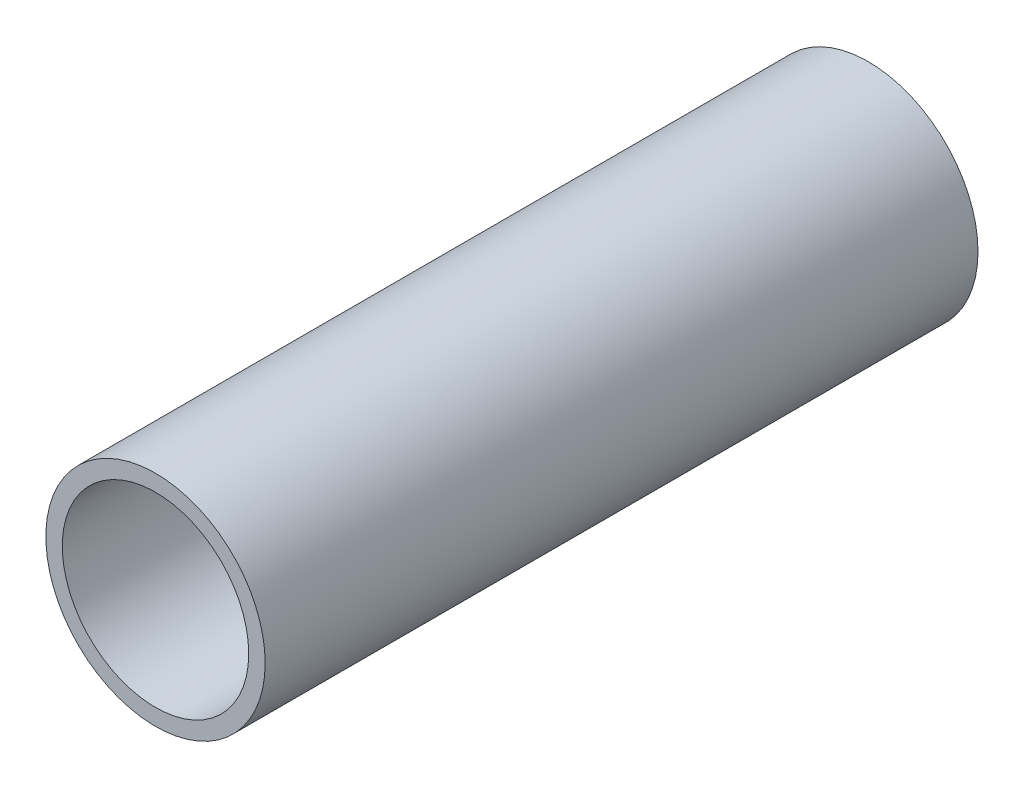
ISO-10303-21;
HEADER;
FILE_DESCRIPTION(('STEP AP214'),'2;1');
FILE_NAME('part.step','',(''),(''),'','','');
FILE_SCHEMA(('AUTOMOTIVE_DESIGN { 1 0 10303 214 1 1 1 1 }'));
ENDSEC;
DATA;
#1=APPLICATION_CONTEXT('core data for automotive mechanical design processes');
#2=APPLICATION_PROTOCOL_DEFINITION('international standard','automotive_design',2000,#1);
#3=PRODUCT_CONTEXT('',#1,'mechanical');
#4=PRODUCT('Part','Part','',(#3));
#5=PRODUCT_RELATED_PRODUCT_CATEGORY('part','',(#4));
#6=PRODUCT_DEFINITION_FORMATION('','',#4);
#7=PRODUCT_DEFINITION_CONTEXT('part definition',#1,'design');
#8=PRODUCT_DEFINITION('design','',#6,#7);
#9=PRODUCT_DEFINITION_SHAPE('','',#8);
#10=(LENGTH_UNIT() NAMED_UNIT(*) SI_UNIT(.MILLI.,.METRE.));
#11=(NAMED_UNIT(*) PLANE_ANGLE_UNIT() SI_UNIT($,.RADIAN.));
#12=(NAMED_UNIT(*) SI_UNIT($,.STERADIAN.) SOLID_ANGLE_UNIT());
#13=UNCERTAINTY_MEASURE_WITH_UNIT(LENGTH_MEASURE(1.E-05),#10,'distance_accuracy_value','');
#14=(GEOMETRIC_REPRESENTATION_CONTEXT(3) GLOBAL_UNCERTAINTY_ASSIGNED_CONTEXT((#13)) GLOBAL_UNIT_ASSIGNED_CONTEXT((#10,
#11,#12)) REPRESENTATION_CONTEXT('',''));
#15=CARTESIAN_POINT('',(0.,0.,0.));
#16=DIRECTION('',(0.,0.,1.));
#17=DIRECTION('',(1.,0.,0.));
#18=AXIS2_PLACEMENT_3D('',#15,#16,#17);
#19=CARTESIAN_POINT('',(0.,0.,65.));
#20=DIRECTION('',(0.,0.,1.));
#21=DIRECTION('',(1.,0.,0.));
#22=AXIS2_PLACEMENT_3D('',#19,#20,#21);
#23=PLANE('',#22);
#24=CARTESIAN_POINT('',(0.,0.,65.));
#25=DIRECTION('',(0.,0.,1.));
#26=DIRECTION('',(1.,0.,0.));
#27=AXIS2_PLACEMENT_3D('',#24,#25,#26);
#28=CIRCLE('',#27,10.);
#29=CARTESIAN_POINT('',(10.,0.,65.));
#30=VERTEX_POINT('',#29);
#31=EDGE_CURVE('E10',#30,#30,#28,.T.);
#32=ORIENTED_EDGE('',*,*,#31,.T.);
#33=EDGE_LOOP('',(#32));
#34=FACE_BOUND('',#33,.T.);
#35=CARTESIAN_POINT('',(0.,0.,65.));
#36=DIRECTION('',(0.,0.,1.));
#37=DIRECTION('',(1.,0.,0.));
#38=AXIS2_PLACEMENT_3D('',#35,#36,#37);
#39=CIRCLE('',#38,8.5);
#40=CARTESIAN_POINT('',(8.5,0.,65.));
#41=VERTEX_POINT('',#40);
#42=EDGE_CURVE('E50',#41,#41,#39,.T.);
#43=ORIENTED_EDGE('',*,*,#42,.F.);
#44=EDGE_LOOP('',(#43));
#45=FACE_BOUND('',#44,.T.);
#46=ADVANCED_FACE('F37',(#34,#45),#23,.T.);
#47=CARTESIAN_POINT('',(0.,0.,0.));
#48=DIRECTION('',(0.,0.,1.));
#49=DIRECTION('',(1.,0.,0.));
#50=AXIS2_PLACEMENT_3D('',#47,#48,#49);
#51=PLANE('',#50);
#52=CARTESIAN_POINT('',(0.,0.,0.));
#53=DIRECTION('',(0.,0.,1.));
#54=DIRECTION('',(1.,0.,0.));
#55=AXIS2_PLACEMENT_3D('',#52,#53,#54);
#56=CIRCLE('',#55,10.);
#57=CARTESIAN_POINT('',(10.,0.,0.));
#58=VERTEX_POINT('',#57);
#59=EDGE_CURVE('E41',#58,#58,#56,.T.);
#60=ORIENTED_EDGE('',*,*,#59,.F.);
#61=EDGE_LOOP('',(#60));
#62=FACE_BOUND('',#61,.T.);
#63=CARTESIAN_POINT('',(0.,0.,0.));
#64=DIRECTION('',(0.,0.,1.));
#65=DIRECTION('',(1.,0.,0.));
#66=AXIS2_PLACEMENT_3D('',#63,#64,#65);
#67=CIRCLE('',#66,8.5);
#68=CARTESIAN_POINT('',(8.5,0.,0.));
#69=VERTEX_POINT('',#68);
#70=EDGE_CURVE('E52',#69,#69,#67,.T.);
#71=ORIENTED_EDGE('',*,*,#70,.T.);
#72=EDGE_LOOP('',(#71));
#73=FACE_BOUND('',#72,.T.);
#74=ADVANCED_FACE('F64',(#62,#73),#51,.F.);
#75=CARTESIAN_POINT('',(0.,0.,65.));
#76=DIRECTION('',(0.,0.,-1.));
#77=DIRECTION('',(-1.,0.,0.));
#78=AXIS2_PLACEMENT_3D('',#75,#76,#77);
#79=CYLINDRICAL_SURFACE('',#78,10.);
#80=ORIENTED_EDGE('',*,*,#31,.F.);
#81=EDGE_LOOP('',(#80));
#82=FACE_BOUND('',#81,.T.);
#83=ORIENTED_EDGE('',*,*,#59,.T.);
#84=EDGE_LOOP('',(#83));
#85=FACE_BOUND('',#84,.T.);
#86=ADVANCED_FACE('F39',(#82,#85),#79,.T.);
#87=CARTESIAN_POINT('',(0.,0.,65.));
#88=DIRECTION('',(0.,0.,-1.));
#89=DIRECTION('',(-1.,0.,0.));
#90=AXIS2_PLACEMENT_3D('',#87,#88,#89);
#91=CYLINDRICAL_SURFACE('',#90,8.5);
#92=ORIENTED_EDGE('',*,*,#42,.T.);
#93=EDGE_LOOP('',(#92));
#94=FACE_BOUND('',#93,.T.);
#95=ORIENTED_EDGE('',*,*,#70,.F.);
#96=EDGE_LOOP('',(#95));
#97=FACE_BOUND('',#96,.T.);
#98=ADVANCED_FACE('F60',(#94,#97),#91,.F.);
#99=CLOSED_SHELL('',(#46,#74,#86,#98));
#100=MANIFOLD_SOLID_BREP('B2',#99);
#101=ADVANCED_BREP_SHAPE_REPRESENTATION('',(#18,#100),#14);
#102=SHAPE_DEFINITION_REPRESENTATION(#9,#101);
ENDSEC;
END-ISO-10303-21;
